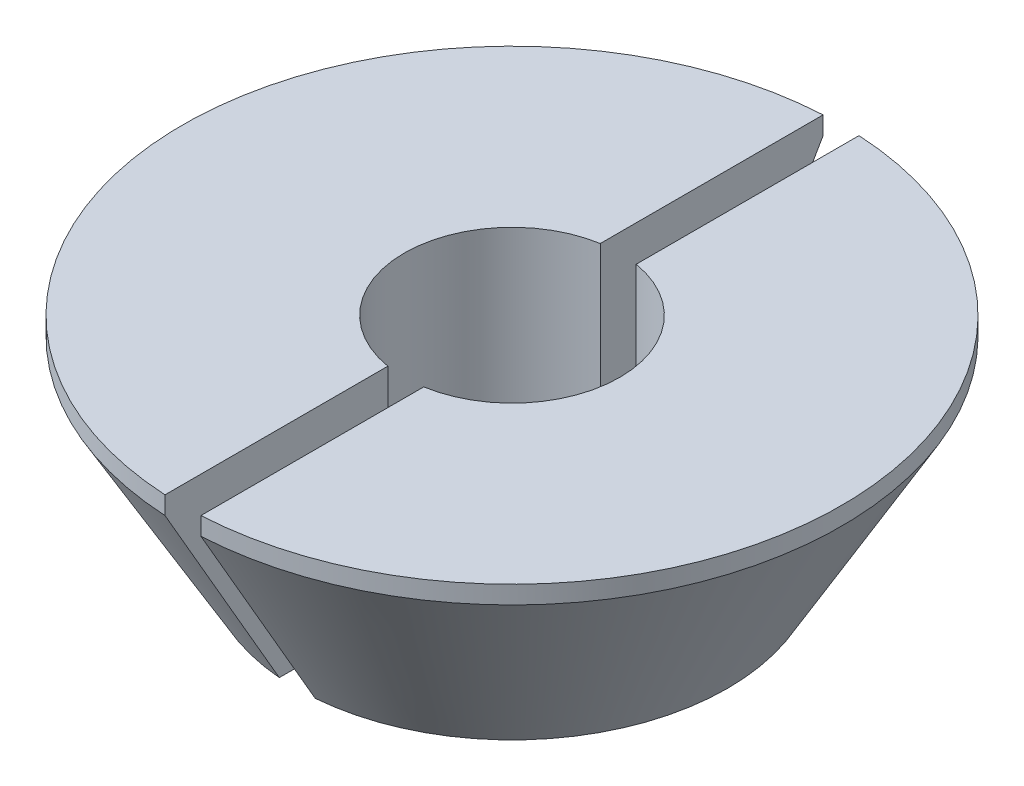
ISO-10303-21;
HEADER;
FILE_DESCRIPTION(('STEP AP214'),'2;1');
FILE_NAME('part.step','',(''),(''),'','','');
FILE_SCHEMA(('AUTOMOTIVE_DESIGN { 1 0 10303 214 1 1 1 1 }'));
ENDSEC;
DATA;
#1=APPLICATION_CONTEXT('core data for automotive mechanical design processes');
#2=APPLICATION_PROTOCOL_DEFINITION('international standard','automotive_design',2000,#1);
#3=PRODUCT_CONTEXT('',#1,'mechanical');
#4=PRODUCT('Part','Part','',(#3));
#5=PRODUCT_RELATED_PRODUCT_CATEGORY('part','',(#4));
#6=PRODUCT_DEFINITION_FORMATION('','',#4);
#7=PRODUCT_DEFINITION_CONTEXT('part definition',#1,'design');
#8=PRODUCT_DEFINITION('design','',#6,#7);
#9=PRODUCT_DEFINITION_SHAPE('','',#8);
#10=(LENGTH_UNIT() NAMED_UNIT(*) SI_UNIT(.MILLI.,.METRE.));
#11=(NAMED_UNIT(*) PLANE_ANGLE_UNIT() SI_UNIT($,.RADIAN.));
#12=(NAMED_UNIT(*) SI_UNIT($,.STERADIAN.) SOLID_ANGLE_UNIT());
#13=UNCERTAINTY_MEASURE_WITH_UNIT(LENGTH_MEASURE(1.E-05),#10,'distance_accuracy_value','');
#14=(GEOMETRIC_REPRESENTATION_CONTEXT(3) GLOBAL_UNCERTAINTY_ASSIGNED_CONTEXT((#13)) GLOBAL_UNIT_ASSIGNED_CONTEXT((#10,
#11,#12)) REPRESENTATION_CONTEXT('',''));
#15=CARTESIAN_POINT('',(0.,0.,0.));
#16=DIRECTION('',(0.,0.,1.));
#17=DIRECTION('',(1.,0.,0.));
#18=AXIS2_PLACEMENT_3D('',#15,#16,#17);
#19=CARTESIAN_POINT('',(1.5,0.,0.));
#20=DIRECTION('',(0.,-1.,0.));
#21=DIRECTION('',(0.,0.,-1.));
#22=AXIS2_PLACEMENT_3D('',#19,#20,#21);
#23=PLANE('',#22);
#24=DIRECTION('',(0.,0.,-1.));
#25=VECTOR('',#24,1.);
#26=CARTESIAN_POINT('',(-0.25,0.,0.));
#27=LINE('',#26,#25);
#28=CARTESIAN_POINT('',(-0.25,0.,2.98956518577535));
#29=VERTEX_POINT('',#28);
#30=CARTESIAN_POINT('',(-0.25,0.,1.4790199457749));
#31=VERTEX_POINT('',#30);
#32=EDGE_CURVE('E94',#29,#31,#27,.T.);
#33=ORIENTED_EDGE('',*,*,#32,.F.);
#34=CARTESIAN_POINT('',(0.,0.,0.));
#35=DIRECTION('',(0.,-1.,0.));
#36=DIRECTION('',(0.,0.,-1.));
#37=AXIS2_PLACEMENT_3D('',#34,#35,#36);
#38=CIRCLE('',#37,3.);
#39=CARTESIAN_POINT('',(-0.25,0.,-2.98956518577535));
#40=VERTEX_POINT('',#39);
#41=EDGE_CURVE('E120',#29,#40,#38,.T.);
#42=ORIENTED_EDGE('',*,*,#41,.T.);
#43=CARTESIAN_POINT('',(-0.25,0.,-1.4790199457749));
#44=VERTEX_POINT('',#43);
#45=EDGE_CURVE('E59',#44,#40,#27,.T.);
#46=ORIENTED_EDGE('',*,*,#45,.F.);
#47=CARTESIAN_POINT('',(0.,0.,0.));
#48=DIRECTION('',(0.,-1.,0.));
#49=DIRECTION('',(0.,0.,-1.));
#50=AXIS2_PLACEMENT_3D('',#47,#48,#49);
#51=CIRCLE('',#50,1.5);
#52=EDGE_CURVE('E53',#31,#44,#51,.T.);
#53=ORIENTED_EDGE('',*,*,#52,.F.);
#54=EDGE_LOOP('',(#33,#42,#46,#53));
#55=FACE_BOUND('',#54,.T.);
#56=ADVANCED_FACE('F50',(#55),#23,.T.);
#57=CARTESIAN_POINT('',(0.,0.,0.));
#58=DIRECTION('',(0.,1.,0.));
#59=DIRECTION('',(0.,0.,1.));
#60=AXIS2_PLACEMENT_3D('',#57,#58,#59);
#61=CONICAL_SURFACE('',#60,3.,0.523598775598296);
#62=CARTESIAN_POINT('',(-0.25,2.7507,4.58130124994628));
#63=CARTESIAN_POINT('',(-0.25,2.30903869331619,4.32591351485422));
#64=CARTESIAN_POINT('',(-0.25,1.8673922894135,4.07050000695337));
#65=CARTESIAN_POINT('',(-0.25,0.984189530915597,3.55949636803113));
#66=CARTESIAN_POINT('',(-0.25,0.542633178364573,3.303906233477));
#67=CARTESIAN_POINT('',(-0.25,-0.339622352568822,2.79283371340549));
#68=CARTESIAN_POINT('',(-0.25,-0.780321793608892,2.53735178175403));
#69=CARTESIAN_POINT('',(-0.25,-1.44105218951567,2.15358843954454));
#70=CARTESIAN_POINT('',(-0.25,-1.66124069362154,2.02557832036211));
#71=CARTESIAN_POINT('',(-0.25,-2.10143392140064,1.76924257975637));
#72=CARTESIAN_POINT('',(-0.25,-2.32143864525454,1.64091695864369));
#73=CARTESIAN_POINT('',(-0.25,-2.65109607715835,1.44800209859304));
#74=CARTESIAN_POINT('',(-0.25,-2.76088635913062,1.38364801701553));
#75=CARTESIAN_POINT('',(-0.25,-2.9803300633418,1.25469890985087));
#76=CARTESIAN_POINT('',(-0.25,-3.08998348124931,1.19010387688395));
#77=CARTESIAN_POINT('',(-0.25,-3.30913740964915,1.06048997752394));
#78=CARTESIAN_POINT('',(-0.25,-3.41863777119443,0.995470859239245));
#79=CARTESIAN_POINT('',(-0.25,-3.63724384345891,0.864790769509886));
#80=CARTESIAN_POINT('',(-0.25,-3.74634958743458,0.799129853965106));
#81=CARTESIAN_POINT('',(-0.25,-3.90939537672968,0.699661282365487));
#82=CARTESIAN_POINT('',(-0.25,-3.96363523834076,0.666346360197192));
#83=CARTESIAN_POINT('',(-0.25,-4.07180870215679,0.599196123399291));
#84=CARTESIAN_POINT('',(-0.25,-4.12574223386925,0.565360695145046));
#85=CARTESIAN_POINT('',(-0.25,-4.23306950973418,0.496884439905926));
#86=CARTESIAN_POINT('',(-0.25,-4.28646347218791,0.462243959019911));
#87=CARTESIAN_POINT('',(-0.25,-4.36579074139948,0.409159174477317));
#88=CARTESIAN_POINT('',(-0.25,-4.39210140763236,0.391280087003258));
#89=CARTESIAN_POINT('',(-0.25,-4.44434320604288,0.354977478512778));
#90=CARTESIAN_POINT('',(-0.25,-4.47027438553483,0.33655402624742));
#91=CARTESIAN_POINT('',(-0.25,-4.52266837565916,0.298062661536671));
#92=CARTESIAN_POINT('',(-0.25,-4.54910423855885,0.277958058949051));
#93=CARTESIAN_POINT('',(-0.25,-4.60084873672922,0.236317530814226));
#94=CARTESIAN_POINT('',(-0.25,-4.62615798168837,0.214782395545785));
#95=CARTESIAN_POINT('',(-0.25,-4.66308993754925,0.179748160310452));
#96=CARTESIAN_POINT('',(-0.25,-4.67559093480906,0.167185106727956));
#97=CARTESIAN_POINT('',(-0.25,-4.69943002381768,0.140963398301121));
#98=CARTESIAN_POINT('',(-0.25,-4.71076842610208,0.127305037765533));
#99=CARTESIAN_POINT('',(-0.25,-4.72780013017659,0.103401326863321));
#100=CARTESIAN_POINT('',(-0.25,-4.73409556182099,0.093592731116943));
#101=CARTESIAN_POINT('',(-0.25,-4.74527172181693,0.0731955570619793));
#102=CARTESIAN_POINT('',(-0.25,-4.75015585915936,0.0626089370746306));
#103=CARTESIAN_POINT('',(-0.25,-4.75685048371113,0.0434990481810954));
#104=CARTESIAN_POINT('',(-0.25,-4.7591280685593,0.0351433128796545));
#105=CARTESIAN_POINT('',(-0.25,-4.76224238659337,0.0181693372238074));
#106=CARTESIAN_POINT('',(-0.25,-4.76308134868023,0.00955152403865507));
#107=CARTESIAN_POINT('',(-0.25,-4.76319226700787,-0.00771739890612933));
#108=CARTESIAN_POINT('',(-0.25,-4.76246010259888,-0.0163685366759026));
#109=CARTESIAN_POINT('',(-0.25,-4.7595362658046,-0.0334205126405209));
#110=CARTESIAN_POINT('',(-0.25,-4.75734267641434,-0.0418210069156051));
#111=CARTESIAN_POINT('',(-0.25,-4.7505019831396,-0.0619592304748282));
#112=CARTESIAN_POINT('',(-0.25,-4.74519163524888,-0.0734665087299001));
#113=CARTESIAN_POINT('',(-0.25,-4.73293371033722,-0.095574092914156));
#114=CARTESIAN_POINT('',(-0.25,-4.7259802096446,-0.106170923597351));
#115=CARTESIAN_POINT('',(-0.25,-4.7070387196351,-0.13209112577422));
#116=CARTESIAN_POINT('',(-0.25,-4.69435326661881,-0.146894439765308));
#117=CARTESIAN_POINT('',(-0.25,-4.66769025736414,-0.175305480658227));
#118=CARTESIAN_POINT('',(-0.25,-4.65370927634657,-0.188909841753358));
#119=CARTESIAN_POINT('',(-0.25,-4.62489057044058,-0.215375053317189));
#120=CARTESIAN_POINT('',(-0.25,-4.6100476605207,-0.228230210970388));
#121=CARTESIAN_POINT('',(-0.25,-4.5798908605948,-0.253324488807356));
#122=CARTESIAN_POINT('',(-0.25,-4.56457765032898,-0.265564436365865));
#123=CARTESIAN_POINT('',(-0.25,-4.51251565994685,-0.306031272523835));
#124=CARTESIAN_POINT('',(-0.25,-4.47501976381492,-0.333291260895387));
#125=CARTESIAN_POINT('',(-0.25,-4.39916552518171,-0.386589970874721));
#126=CARTESIAN_POINT('',(-0.25,-4.36080677638868,-0.412628098549821));
#127=CARTESIAN_POINT('',(-0.25,-4.28352722011166,-0.463994605359522));
#128=CARTESIAN_POINT('',(-0.25,-4.24460560273193,-0.489321766313766));
#129=CARTESIAN_POINT('',(-0.25,-4.16645921413618,-0.539482078693725));
#130=CARTESIAN_POINT('',(-0.25,-4.12723450998449,-0.564315335292296));
#131=CARTESIAN_POINT('',(-0.25,-4.00957797274825,-0.638118082618643));
#132=CARTESIAN_POINT('',(-0.25,-3.93084104610306,-0.686600520165435));
#133=CARTESIAN_POINT('',(-0.25,-3.77301865873246,-0.782836710303954));
#134=CARTESIAN_POINT('',(-0.25,-3.69393355473172,-0.830591052041455));
#135=CARTESIAN_POINT('',(-0.25,-3.45673628352789,-0.972993869020174));
#136=CARTESIAN_POINT('',(-0.25,-3.29826269469418,-1.06703981886387));
#137=CARTESIAN_POINT('',(-0.25,-2.98090824736561,-1.25444465684626));
#138=CARTESIAN_POINT('',(-0.25,-2.8220273815574,-1.34780353252918));
#139=CARTESIAN_POINT('',(-0.25,-2.5039848431928,-1.53417038152859));
#140=CARTESIAN_POINT('',(-0.25,-2.34482309162637,-1.62717822012438));
#141=CARTESIAN_POINT('',(-0.25,-2.02636894955049,-1.81296709665629));
#142=CARTESIAN_POINT('',(-0.25,-1.86707655996802,-1.90574813618344));
#143=CARTESIAN_POINT('',(-0.25,-1.38881190555538,-2.18403061474364));
#144=CARTESIAN_POINT('',(-0.25,-1.06971500622449,-2.36931784128168));
#145=CARTESIAN_POINT('',(-0.25,-0.431397409255639,-2.73960581736538));
#146=CARTESIAN_POINT('',(-0.25,-0.11217672700389,-2.92460659345987));
#147=CARTESIAN_POINT('',(-0.25,0.41907591217365,-3.23231481563744));
#148=CARTESIAN_POINT('',(-0.25,0.631082614373461,-3.35506585857978));
#149=CARTESIAN_POINT('',(-0.25,1.05513072496128,-3.60052186016769));
#150=CARTESIAN_POINT('',(-0.25,1.26717213416359,-3.72322681740629));
#151=CARTESIAN_POINT('',(-0.25,1.69112181890541,-3.96851092030808));
#152=CARTESIAN_POINT('',(-0.25,1.90303007906541,-4.0910900925538));
#153=CARTESIAN_POINT('',(-0.25,2.32685695096556,-4.33621661921705));
#154=CARTESIAN_POINT('',(-0.25,2.53877556223929,-4.45876397444102));
#155=CARTESIAN_POINT('',(-0.25,2.7507,-4.58130124994628));
#156=B_SPLINE_CURVE_WITH_KNOTS('',3,(#62,#63,#64,#65,#66,#67,#68,#69,#70,#71,#72,#73,#74,#75,
#76,#77,#78,#79,#80,#81,#82,#83,#84,#85,#86,#87,#88,#89,#90,#91,#92,#93,#94,#95,#96,#97,#98,#99,
#100,#101,#102,#103,#104,#105,#106,#107,#108,#109,#110,#111,#112,#113,#114,#115,#116,#117,#118,
#119,#120,#121,#122,#123,#124,#125,#126,#127,#128,#129,#130,#131,#132,#133,#134,#135,#136,#137,
#138,#139,#140,#141,#142,#143,#144,#145,#146,#147,#148,#149,#150,#151,#152,#153,#154,#155),
.UNSPECIFIED.,.F.,.F.,(4,2,2,2,2,2,2,2,2,2,2,2,2,2,2,2,2,2,2,2,2,2,2,2,2,2,2,2,2,2,2,2,2,2,2,2,
2,2,2,2,2,2,2,2,2,2,4),(0.,1.53055165917343,3.0611348725171,4.58933048642879,5.35341555866001,
6.11749987886954,6.49928262842303,6.88107716867509,7.26312403071503,7.64513790823927,
7.83609813701725,8.02710066054484,8.21802253633585,8.31345052052638,8.40886650363545,
8.50848823555974,8.60805538325472,8.66118823306275,8.7143068536164,8.74920110966569,
8.7840103599953,8.80988829282017,8.8357260958483,8.8616317474188,8.88757144746918,
8.92537235517586,8.96331167447345,9.02163815450574,9.08012347858901,9.13900699899976,
9.19780908524264,9.33681963059197,9.47589706190675,9.61519980798776,9.75447256604529,
10.0318633451113,10.3090162839871,10.8618453748216,11.4146844631641,11.9677176671428,
12.5207469803313,13.6277188834659,14.7345811803759,15.4695178602364,16.2044754006762,
16.9388982175257,17.6733001265235),.UNSPECIFIED.);
#157=CARTESIAN_POINT('',(-0.25,2.75,4.58089650341088));
#158=VERTEX_POINT('',#157);
#159=EDGE_CURVE('E61',#158,#29,#156,.T.);
#160=ORIENTED_EDGE('',*,*,#159,.F.);
#161=CARTESIAN_POINT('',(0.,2.75,0.));
#162=DIRECTION('',(0.,-1.,0.));
#163=DIRECTION('',(0.,0.,-1.));
#164=AXIS2_PLACEMENT_3D('',#161,#162,#163);
#165=CIRCLE('',#164,4.58771324027146);
#166=CARTESIAN_POINT('',(-0.25,2.75,-4.58089650341088));
#167=VERTEX_POINT('',#166);
#168=EDGE_CURVE('E116',#158,#167,#165,.T.);
#169=ORIENTED_EDGE('',*,*,#168,.T.);
#170=EDGE_CURVE('E13',#40,#167,#156,.T.);
#171=ORIENTED_EDGE('',*,*,#170,.F.);
#172=ORIENTED_EDGE('',*,*,#41,.F.);
#173=EDGE_LOOP('',(#160,#169,#171,#172));
#174=FACE_BOUND('',#173,.T.);
#175=ADVANCED_FACE('F133',(#174),#61,.T.);
#176=CARTESIAN_POINT('',(4.58771324027146,3.,0.));
#177=DIRECTION('',(0.,1.,0.));
#178=DIRECTION('',(0.,0.,1.));
#179=AXIS2_PLACEMENT_3D('',#176,#177,#178);
#180=PLANE('',#179);
#181=DIRECTION('',(0.,0.,1.));
#182=VECTOR('',#181,1.);
#183=CARTESIAN_POINT('',(-0.25,3.,-4.58771324027146));
#184=LINE('',#183,#182);
#185=CARTESIAN_POINT('',(-0.25,3.,-4.58089650341088));
#186=VERTEX_POINT('',#185);
#187=CARTESIAN_POINT('',(-0.25,3.,-1.4790199457749));
#188=VERTEX_POINT('',#187);
#189=EDGE_CURVE('E125',#186,#188,#184,.T.);
#190=ORIENTED_EDGE('',*,*,#189,.F.);
#191=CARTESIAN_POINT('',(0.,3.,0.));
#192=DIRECTION('',(0.,-1.,0.));
#193=DIRECTION('',(0.,0.,-1.));
#194=AXIS2_PLACEMENT_3D('',#191,#192,#193);
#195=CIRCLE('',#194,4.58771324027146);
#196=CARTESIAN_POINT('',(-0.25,3.,4.58089650341089));
#197=VERTEX_POINT('',#196);
#198=EDGE_CURVE('E112',#197,#186,#195,.T.);
#199=ORIENTED_EDGE('',*,*,#198,.F.);
#200=CARTESIAN_POINT('',(-0.25,3.,1.4790199457749));
#201=VERTEX_POINT('',#200);
#202=EDGE_CURVE('E109',#201,#197,#184,.T.);
#203=ORIENTED_EDGE('',*,*,#202,.F.);
#204=CARTESIAN_POINT('',(0.,3.,0.));
#205=DIRECTION('',(0.,-1.,0.));
#206=DIRECTION('',(0.,0.,-1.));
#207=AXIS2_PLACEMENT_3D('',#204,#205,#206);
#208=CIRCLE('',#207,1.5);
#209=EDGE_CURVE('E108',#201,#188,#208,.T.);
#210=ORIENTED_EDGE('',*,*,#209,.T.);
#211=EDGE_LOOP('',(#190,#199,#203,#210));
#212=FACE_BOUND('',#211,.T.);
#213=ADVANCED_FACE('F143',(#212),#180,.T.);
#214=CARTESIAN_POINT('',(0.,0.,0.));
#215=DIRECTION('',(0.,-1.,0.));
#216=DIRECTION('',(0.,0.,-1.));
#217=AXIS2_PLACEMENT_3D('',#214,#215,#216);
#218=CYLINDRICAL_SURFACE('',#217,1.5);
#219=DIRECTION('',(0.,-1.,0.));
#220=VECTOR('',#219,1.);
#221=CARTESIAN_POINT('',(-0.25,0.,-1.4790199457749));
#222=LINE('',#221,#220);
#223=EDGE_CURVE('E160',#188,#44,#222,.T.);
#224=ORIENTED_EDGE('',*,*,#223,.F.);
#225=ORIENTED_EDGE('',*,*,#209,.F.);
#226=DIRECTION('',(0.,-1.,0.));
#227=VECTOR('',#226,1.);
#228=CARTESIAN_POINT('',(-0.25,0.,1.4790199457749));
#229=LINE('',#228,#227);
#230=EDGE_CURVE('E91',#31,#201,#229,.F.);
#231=ORIENTED_EDGE('',*,*,#230,.F.);
#232=ORIENTED_EDGE('',*,*,#52,.T.);
#233=EDGE_LOOP('',(#224,#225,#231,#232));
#234=FACE_BOUND('',#233,.T.);
#235=ADVANCED_FACE('F106',(#234),#218,.F.);
#236=CARTESIAN_POINT('',(0.,0.,0.));
#237=DIRECTION('',(0.,-1.,0.));
#238=DIRECTION('',(0.,0.,-1.));
#239=AXIS2_PLACEMENT_3D('',#236,#237,#238);
#240=CYLINDRICAL_SURFACE('',#239,4.58771324027146);
#241=DIRECTION('',(0.,-1.,0.));
#242=VECTOR('',#241,1.);
#243=CARTESIAN_POINT('',(-0.25,0.,-4.58089650341088));
#244=LINE('',#243,#242);
#245=EDGE_CURVE('E124',#167,#186,#244,.F.);
#246=ORIENTED_EDGE('',*,*,#245,.F.);
#247=ORIENTED_EDGE('',*,*,#168,.F.);
#248=DIRECTION('',(0.,-1.,0.));
#249=VECTOR('',#248,1.);
#250=CARTESIAN_POINT('',(-0.25,0.,4.58089650341088));
#251=LINE('',#250,#249);
#252=EDGE_CURVE('E114',#197,#158,#251,.T.);
#253=ORIENTED_EDGE('',*,*,#252,.F.);
#254=ORIENTED_EDGE('',*,*,#198,.T.);
#255=EDGE_LOOP('',(#246,#247,#253,#254));
#256=FACE_BOUND('',#255,.T.);
#257=ADVANCED_FACE('F140',(#256),#240,.T.);
#258=CARTESIAN_POINT('',(-0.25,-3.,-4.58771324027146));
#259=DIRECTION('',(-1.,0.,0.));
#260=DIRECTION('',(0.,0.,1.));
#261=AXIS2_PLACEMENT_3D('',#258,#259,#260);
#262=PLANE('',#261);
#263=ORIENTED_EDGE('',*,*,#252,.T.);
#264=ORIENTED_EDGE('',*,*,#159,.T.);
#265=ORIENTED_EDGE('',*,*,#32,.T.);
#266=ORIENTED_EDGE('',*,*,#230,.T.);
#267=ORIENTED_EDGE('',*,*,#202,.T.);
#268=EDGE_LOOP('',(#263,#264,#265,#266,#267));
#269=FACE_BOUND('',#268,.T.);
#270=ADVANCED_FACE('F95',(#269),#262,.F.);
#271=ORIENTED_EDGE('',*,*,#245,.T.);
#272=ORIENTED_EDGE('',*,*,#189,.T.);
#273=ORIENTED_EDGE('',*,*,#223,.T.);
#274=ORIENTED_EDGE('',*,*,#45,.T.);
#275=ORIENTED_EDGE('',*,*,#170,.T.);
#276=EDGE_LOOP('',(#271,#272,#273,#274,#275));
#277=FACE_BOUND('',#276,.T.);
#278=ADVANCED_FACE('F139',(#277),#262,.F.);
#279=CLOSED_SHELL('',(#56,#175,#213,#235,#257,#270,#278));
#280=MANIFOLD_SOLID_BREP('B2',#279);
#281=CARTESIAN_POINT('',(0.,0.,0.));
#282=DIRECTION('',(0.,-1.,0.));
#283=DIRECTION('',(0.,0.,-1.));
#284=AXIS2_PLACEMENT_3D('',#281,#282,#283);
#285=CYLINDRICAL_SURFACE('',#284,1.5);
#286=DIRECTION('',(0.,-1.,0.));
#287=VECTOR('',#286,1.);
#288=CARTESIAN_POINT('',(0.25,0.,1.4790199457749));
#289=LINE('',#288,#287);
#290=CARTESIAN_POINT('',(0.25,3.,1.4790199457749));
#291=VERTEX_POINT('',#290);
#292=CARTESIAN_POINT('',(0.25,0.,1.4790199457749));
#293=VERTEX_POINT('',#292);
#294=EDGE_CURVE('E48',#291,#293,#289,.T.);
#295=ORIENTED_EDGE('',*,*,#294,.F.);
#296=CARTESIAN_POINT('',(0.,3.,0.));
#297=DIRECTION('',(0.,-1.,0.));
#298=DIRECTION('',(0.,0.,-1.));
#299=AXIS2_PLACEMENT_3D('',#296,#297,#298);
#300=CIRCLE('',#299,1.5);
#301=CARTESIAN_POINT('',(0.25,3.,-1.4790199457749));
#302=VERTEX_POINT('',#301);
#303=EDGE_CURVE('E296',#302,#291,#300,.T.);
#304=ORIENTED_EDGE('',*,*,#303,.F.);
#305=DIRECTION('',(0.,-1.,0.));
#306=VECTOR('',#305,1.);
#307=CARTESIAN_POINT('',(0.25,0.,-1.4790199457749));
#308=LINE('',#307,#306);
#309=CARTESIAN_POINT('',(0.25,0.,-1.4790199457749));
#310=VERTEX_POINT('',#309);
#311=EDGE_CURVE('E238',#310,#302,#308,.F.);
#312=ORIENTED_EDGE('',*,*,#311,.F.);
#313=CARTESIAN_POINT('',(0.,0.,0.));
#314=DIRECTION('',(0.,-1.,0.));
#315=DIRECTION('',(0.,0.,-1.));
#316=AXIS2_PLACEMENT_3D('',#313,#314,#315);
#317=CIRCLE('',#316,1.5);
#318=EDGE_CURVE('E300',#310,#293,#317,.T.);
#319=ORIENTED_EDGE('',*,*,#318,.T.);
#320=EDGE_LOOP('',(#295,#304,#312,#319));
#321=FACE_BOUND('',#320,.T.);
#322=ADVANCED_FACE('F230',(#321),#285,.F.);
#323=CARTESIAN_POINT('',(4.58771324027146,3.,0.));
#324=DIRECTION('',(0.,1.,0.));
#325=DIRECTION('',(0.,0.,1.));
#326=AXIS2_PLACEMENT_3D('',#323,#324,#325);
#327=PLANE('',#326);
#328=DIRECTION('',(0.,0.,1.));
#329=VECTOR('',#328,1.);
#330=CARTESIAN_POINT('',(0.25,3.,-4.58771324027146));
#331=LINE('',#330,#329);
#332=CARTESIAN_POINT('',(0.25,3.,4.58089650341089));
#333=VERTEX_POINT('',#332);
#334=EDGE_CURVE('E244',#291,#333,#331,.T.);
#335=ORIENTED_EDGE('',*,*,#334,.T.);
#336=CARTESIAN_POINT('',(0.,3.,0.));
#337=DIRECTION('',(0.,-1.,0.));
#338=DIRECTION('',(0.,0.,-1.));
#339=AXIS2_PLACEMENT_3D('',#336,#337,#338);
#340=CIRCLE('',#339,4.58771324027146);
#341=CARTESIAN_POINT('',(0.25,3.,-4.58089650341088));
#342=VERTEX_POINT('',#341);
#343=EDGE_CURVE('E289',#342,#333,#340,.T.);
#344=ORIENTED_EDGE('',*,*,#343,.F.);
#345=EDGE_CURVE('E274',#342,#302,#331,.T.);
#346=ORIENTED_EDGE('',*,*,#345,.T.);
#347=ORIENTED_EDGE('',*,*,#303,.T.);
#348=EDGE_LOOP('',(#335,#344,#346,#347));
#349=FACE_BOUND('',#348,.T.);
#350=ADVANCED_FACE('F295',(#349),#327,.T.);
#351=CARTESIAN_POINT('',(0.,0.,0.));
#352=DIRECTION('',(0.,-1.,0.));
#353=DIRECTION('',(0.,0.,-1.));
#354=AXIS2_PLACEMENT_3D('',#351,#352,#353);
#355=CYLINDRICAL_SURFACE('',#354,4.58771324027146);
#356=DIRECTION('',(0.,-1.,0.));
#357=VECTOR('',#356,1.);
#358=CARTESIAN_POINT('',(0.25,0.,4.58089650341088));
#359=LINE('',#358,#357);
#360=CARTESIAN_POINT('',(0.25,2.75,4.58089650341088));
#361=VERTEX_POINT('',#360);
#362=EDGE_CURVE('E314',#361,#333,#359,.F.);
#363=ORIENTED_EDGE('',*,*,#362,.F.);
#364=CARTESIAN_POINT('',(0.,2.75,0.));
#365=DIRECTION('',(0.,-1.,0.));
#366=DIRECTION('',(0.,0.,-1.));
#367=AXIS2_PLACEMENT_3D('',#364,#365,#366);
#368=CIRCLE('',#367,4.58771324027146);
#369=CARTESIAN_POINT('',(0.25,2.75,-4.58089650341088));
#370=VERTEX_POINT('',#369);
#371=EDGE_CURVE('E291',#370,#361,#368,.T.);
#372=ORIENTED_EDGE('',*,*,#371,.F.);
#373=DIRECTION('',(0.,-1.,0.));
#374=VECTOR('',#373,1.);
#375=CARTESIAN_POINT('',(0.25,0.,-4.58089650341088));
#376=LINE('',#375,#374);
#377=EDGE_CURVE('E277',#342,#370,#376,.T.);
#378=ORIENTED_EDGE('',*,*,#377,.F.);
#379=ORIENTED_EDGE('',*,*,#343,.T.);
#380=EDGE_LOOP('',(#363,#372,#378,#379));
#381=FACE_BOUND('',#380,.T.);
#382=ADVANCED_FACE('F288',(#381),#355,.T.);
#383=CARTESIAN_POINT('',(0.,0.,0.));
#384=DIRECTION('',(0.,1.,0.));
#385=DIRECTION('',(0.,0.,1.));
#386=AXIS2_PLACEMENT_3D('',#383,#384,#385);
#387=CONICAL_SURFACE('',#386,3.,0.523598775598296);
#388=CARTESIAN_POINT('',(0.25,2.7507,-4.58130124994628));
#389=CARTESIAN_POINT('',(0.25,2.30903869331619,-4.32591351485422));
#390=CARTESIAN_POINT('',(0.25,1.8673922894135,-4.07050000695337));
#391=CARTESIAN_POINT('',(0.25,0.984189530915597,-3.55949636803113));
#392=CARTESIAN_POINT('',(0.25,0.542633178364573,-3.303906233477));
#393=CARTESIAN_POINT('',(0.25,-0.339622352568822,-2.79283371340549));
#394=CARTESIAN_POINT('',(0.25,-0.780321793608892,-2.53735178175403));
#395=CARTESIAN_POINT('',(0.25,-1.44105218951567,-2.15358843954454));
#396=CARTESIAN_POINT('',(0.25,-1.66124069362154,-2.02557832036211));
#397=CARTESIAN_POINT('',(0.25,-2.10143392140064,-1.76924257975637));
#398=CARTESIAN_POINT('',(0.25,-2.32143864525454,-1.64091695864369));
#399=CARTESIAN_POINT('',(0.25,-2.65109607715835,-1.44800209859304));
#400=CARTESIAN_POINT('',(0.25,-2.76088635913062,-1.38364801701553));
#401=CARTESIAN_POINT('',(0.25,-2.9803300633418,-1.25469890985087));
#402=CARTESIAN_POINT('',(0.25,-3.08998348124931,-1.19010387688395));
#403=CARTESIAN_POINT('',(0.25,-3.30913740964915,-1.06048997752394));
#404=CARTESIAN_POINT('',(0.25,-3.41863777119443,-0.995470859239245));
#405=CARTESIAN_POINT('',(0.25,-3.63724384345891,-0.864790769509886));
#406=CARTESIAN_POINT('',(0.25,-3.74634958743458,-0.799129853965106));
#407=CARTESIAN_POINT('',(0.25,-3.90939537672968,-0.699661282365487));
#408=CARTESIAN_POINT('',(0.25,-3.96363523834076,-0.666346360197192));
#409=CARTESIAN_POINT('',(0.25,-4.07180870215679,-0.599196123399291));
#410=CARTESIAN_POINT('',(0.25,-4.12574223386925,-0.565360695145046));
#411=CARTESIAN_POINT('',(0.25,-4.23306950973418,-0.496884439905926));
#412=CARTESIAN_POINT('',(0.25,-4.28646347218791,-0.462243959019911));
#413=CARTESIAN_POINT('',(0.25,-4.36579074139948,-0.409159174477317));
#414=CARTESIAN_POINT('',(0.25,-4.39210140763236,-0.391280087003258));
#415=CARTESIAN_POINT('',(0.25,-4.44434320604288,-0.354977478512778));
#416=CARTESIAN_POINT('',(0.25,-4.47027438553483,-0.33655402624742));
#417=CARTESIAN_POINT('',(0.25,-4.52266837565916,-0.298062661536671));
#418=CARTESIAN_POINT('',(0.25,-4.54910423855885,-0.277958058949051));
#419=CARTESIAN_POINT('',(0.25,-4.60084873672922,-0.236317530814226));
#420=CARTESIAN_POINT('',(0.25,-4.62615798168837,-0.214782395545785));
#421=CARTESIAN_POINT('',(0.25,-4.66308993754925,-0.179748160310452));
#422=CARTESIAN_POINT('',(0.25,-4.67559093480906,-0.167185106727956));
#423=CARTESIAN_POINT('',(0.25,-4.69943002381768,-0.140963398301121));
#424=CARTESIAN_POINT('',(0.25,-4.71076842610208,-0.127305037765533));
#425=CARTESIAN_POINT('',(0.25,-4.72780013017659,-0.103401326863321));
#426=CARTESIAN_POINT('',(0.25,-4.73409556182099,-0.093592731116943));
#427=CARTESIAN_POINT('',(0.25,-4.74527172181693,-0.0731955570619793));
#428=CARTESIAN_POINT('',(0.25,-4.75015585915936,-0.0626089370746306));
#429=CARTESIAN_POINT('',(0.25,-4.75685048371113,-0.0434990481810954));
#430=CARTESIAN_POINT('',(0.25,-4.7591280685593,-0.0351433128796545));
#431=CARTESIAN_POINT('',(0.25,-4.76224238659337,-0.0181693372238074));
#432=CARTESIAN_POINT('',(0.25,-4.76308134868023,-0.00955152403865507));
#433=CARTESIAN_POINT('',(0.25,-4.76319226700787,0.00771739890612933));
#434=CARTESIAN_POINT('',(0.25,-4.76246010259888,0.0163685366759026));
#435=CARTESIAN_POINT('',(0.25,-4.7595362658046,0.0334205126405209));
#436=CARTESIAN_POINT('',(0.25,-4.75734267641434,0.0418210069156051));
#437=CARTESIAN_POINT('',(0.25,-4.7505019831396,0.0619592304748282));
#438=CARTESIAN_POINT('',(0.25,-4.74519163524888,0.0734665087299001));
#439=CARTESIAN_POINT('',(0.25,-4.73293371033722,0.095574092914156));
#440=CARTESIAN_POINT('',(0.25,-4.7259802096446,0.106170923597351));
#441=CARTESIAN_POINT('',(0.25,-4.7070387196351,0.13209112577422));
#442=CARTESIAN_POINT('',(0.25,-4.69435326661881,0.146894439765308));
#443=CARTESIAN_POINT('',(0.25,-4.66769025736414,0.175305480658227));
#444=CARTESIAN_POINT('',(0.25,-4.65370927634657,0.188909841753358));
#445=CARTESIAN_POINT('',(0.25,-4.62489057044058,0.215375053317189));
#446=CARTESIAN_POINT('',(0.25,-4.6100476605207,0.228230210970388));
#447=CARTESIAN_POINT('',(0.25,-4.5798908605948,0.253324488807356));
#448=CARTESIAN_POINT('',(0.25,-4.56457765032898,0.265564436365865));
#449=CARTESIAN_POINT('',(0.25,-4.51251565994685,0.306031272523835));
#450=CARTESIAN_POINT('',(0.25,-4.47501976381492,0.333291260895387));
#451=CARTESIAN_POINT('',(0.25,-4.39916552518171,0.386589970874721));
#452=CARTESIAN_POINT('',(0.25,-4.36080677638868,0.412628098549821));
#453=CARTESIAN_POINT('',(0.25,-4.28352722011166,0.463994605359522));
#454=CARTESIAN_POINT('',(0.25,-4.24460560273193,0.489321766313766));
#455=CARTESIAN_POINT('',(0.25,-4.16645921413618,0.539482078693725));
#456=CARTESIAN_POINT('',(0.25,-4.12723450998449,0.564315335292296));
#457=CARTESIAN_POINT('',(0.25,-4.00957797274825,0.638118082618643));
#458=CARTESIAN_POINT('',(0.25,-3.93084104610306,0.686600520165435));
#459=CARTESIAN_POINT('',(0.25,-3.77301865873246,0.782836710303954));
#460=CARTESIAN_POINT('',(0.25,-3.69393355473172,0.830591052041455));
#461=CARTESIAN_POINT('',(0.25,-3.45673628352789,0.972993869020174));
#462=CARTESIAN_POINT('',(0.25,-3.29826269469418,1.06703981886387));
#463=CARTESIAN_POINT('',(0.25,-2.98090824736561,1.25444465684626));
#464=CARTESIAN_POINT('',(0.25,-2.8220273815574,1.34780353252918));
#465=CARTESIAN_POINT('',(0.25,-2.5039848431928,1.53417038152859));
#466=CARTESIAN_POINT('',(0.25,-2.34482309162637,1.62717822012438));
#467=CARTESIAN_POINT('',(0.25,-2.02636894955049,1.81296709665629));
#468=CARTESIAN_POINT('',(0.25,-1.86707655996802,1.90574813618344));
#469=CARTESIAN_POINT('',(0.25,-1.38881190555538,2.18403061474364));
#470=CARTESIAN_POINT('',(0.25,-1.06971500622449,2.36931784128168));
#471=CARTESIAN_POINT('',(0.25,-0.431397409255639,2.73960581736538));
#472=CARTESIAN_POINT('',(0.25,-0.11217672700389,2.92460659345987));
#473=CARTESIAN_POINT('',(0.25,0.41907591217365,3.23231481563744));
#474=CARTESIAN_POINT('',(0.25,0.631082614373461,3.35506585857978));
#475=CARTESIAN_POINT('',(0.25,1.05513072496128,3.60052186016769));
#476=CARTESIAN_POINT('',(0.25,1.26717213416359,3.72322681740629));
#477=CARTESIAN_POINT('',(0.25,1.69112181890541,3.96851092030808));
#478=CARTESIAN_POINT('',(0.25,1.90303007906541,4.0910900925538));
#479=CARTESIAN_POINT('',(0.25,2.32685695096556,4.33621661921705));
#480=CARTESIAN_POINT('',(0.25,2.53877556223929,4.45876397444102));
#481=CARTESIAN_POINT('',(0.25,2.7507,4.58130124994628));
#482=B_SPLINE_CURVE_WITH_KNOTS('',3,(#388,#389,#390,#391,#392,#393,#394,#395,#396,#397,#398,
#399,#400,#401,#402,#403,#404,#405,#406,#407,#408,#409,#410,#411,#412,#413,#414,#415,#416,#417,
#418,#419,#420,#421,#422,#423,#424,#425,#426,#427,#428,#429,#430,#431,#432,#433,#434,#435,#436,
#437,#438,#439,#440,#441,#442,#443,#444,#445,#446,#447,#448,#449,#450,#451,#452,#453,#454,#455,
#456,#457,#458,#459,#460,#461,#462,#463,#464,#465,#466,#467,#468,#469,#470,#471,#472,#473,#474,
#475,#476,#477,#478,#479,#480,#481),.UNSPECIFIED.,.F.,.F.,(4,2,2,2,2,2,2,2,2,2,2,2,2,2,2,2,2,2,
2,2,2,2,2,2,2,2,2,2,2,2,2,2,2,2,2,2,2,2,2,2,2,2,2,2,2,2,4),(0.,1.53055165917343,3.0611348725171,
4.58933048642879,5.35341555866001,6.11749987886954,6.49928262842303,6.88107716867509,
7.26312403071503,7.64513790823927,7.83609813701725,8.02710066054484,8.21802253633585,
8.31345052052638,8.40886650363545,8.50848823555974,8.60805538325472,8.66118823306275,
8.7143068536164,8.74920110966569,8.7840103599953,8.80988829282017,8.8357260958483,
8.8616317474188,8.88757144746918,8.92537235517586,8.96331167447345,9.02163815450574,
9.08012347858901,9.13900699899976,9.19780908524264,9.33681963059197,9.47589706190675,
9.61519980798776,9.75447256604529,10.0318633451113,10.3090162839871,10.8618453748216,
11.4146844631641,11.9677176671428,12.5207469803313,13.6277188834659,14.7345811803759,
15.4695178602364,16.2044754006762,16.9388982175257,17.6733001265235),.UNSPECIFIED.);
#483=CARTESIAN_POINT('',(0.25,0.,-2.98956518577535));
#484=VERTEX_POINT('',#483);
#485=EDGE_CURVE('E293',#370,#484,#482,.T.);
#486=ORIENTED_EDGE('',*,*,#485,.F.);
#487=ORIENTED_EDGE('',*,*,#371,.T.);
#488=CARTESIAN_POINT('',(0.25,0.,2.98956518577535));
#489=VERTEX_POINT('',#488);
#490=EDGE_CURVE('E313',#489,#361,#482,.T.);
#491=ORIENTED_EDGE('',*,*,#490,.F.);
#492=CARTESIAN_POINT('',(0.,0.,0.));
#493=DIRECTION('',(0.,-1.,0.));
#494=DIRECTION('',(0.,0.,-1.));
#495=AXIS2_PLACEMENT_3D('',#492,#493,#494);
#496=CIRCLE('',#495,3.);
#497=EDGE_CURVE('E298',#484,#489,#496,.T.);
#498=ORIENTED_EDGE('',*,*,#497,.F.);
#499=EDGE_LOOP('',(#486,#487,#491,#498));
#500=FACE_BOUND('',#499,.T.);
#501=ADVANCED_FACE('F312',(#500),#387,.T.);
#502=CARTESIAN_POINT('',(1.5,0.,0.));
#503=DIRECTION('',(0.,-1.,0.));
#504=DIRECTION('',(0.,0.,-1.));
#505=AXIS2_PLACEMENT_3D('',#502,#503,#504);
#506=PLANE('',#505);
#507=DIRECTION('',(0.,0.,1.));
#508=VECTOR('',#507,1.);
#509=CARTESIAN_POINT('',(0.25,0.,0.));
#510=LINE('',#509,#508);
#511=EDGE_CURVE('E252',#484,#310,#510,.T.);
#512=ORIENTED_EDGE('',*,*,#511,.F.);
#513=ORIENTED_EDGE('',*,*,#497,.T.);
#514=EDGE_CURVE('E292',#293,#489,#510,.T.);
#515=ORIENTED_EDGE('',*,*,#514,.F.);
#516=ORIENTED_EDGE('',*,*,#318,.F.);
#517=EDGE_LOOP('',(#512,#513,#515,#516));
#518=FACE_BOUND('',#517,.T.);
#519=ADVANCED_FACE('F232',(#518),#506,.T.);
#520=CARTESIAN_POINT('',(0.25,-3.,-4.58771324027146));
#521=DIRECTION('',(1.,0.,0.));
#522=DIRECTION('',(0.,0.,-1.));
#523=AXIS2_PLACEMENT_3D('',#520,#521,#522);
#524=PLANE('',#523);
#525=ORIENTED_EDGE('',*,*,#377,.T.);
#526=ORIENTED_EDGE('',*,*,#485,.T.);
#527=ORIENTED_EDGE('',*,*,#511,.T.);
#528=ORIENTED_EDGE('',*,*,#311,.T.);
#529=ORIENTED_EDGE('',*,*,#345,.F.);
#530=EDGE_LOOP('',(#525,#526,#527,#528,#529));
#531=FACE_BOUND('',#530,.T.);
#532=ADVANCED_FACE('F276',(#531),#524,.F.);
#533=ORIENTED_EDGE('',*,*,#362,.T.);
#534=ORIENTED_EDGE('',*,*,#334,.F.);
#535=ORIENTED_EDGE('',*,*,#294,.T.);
#536=ORIENTED_EDGE('',*,*,#514,.T.);
#537=ORIENTED_EDGE('',*,*,#490,.T.);
#538=EDGE_LOOP('',(#533,#534,#535,#536,#537));
#539=FACE_BOUND('',#538,.T.);
#540=ADVANCED_FACE('F328',(#539),#524,.F.);
#541=CLOSED_SHELL('',(#322,#350,#382,#501,#519,#532,#540));
#542=MANIFOLD_SOLID_BREP('B7',#541);
#543=ADVANCED_BREP_SHAPE_REPRESENTATION('',(#18,#280,#542),#14);
#544=SHAPE_DEFINITION_REPRESENTATION(#9,#543);
ENDSEC;
END-ISO-10303-21;
